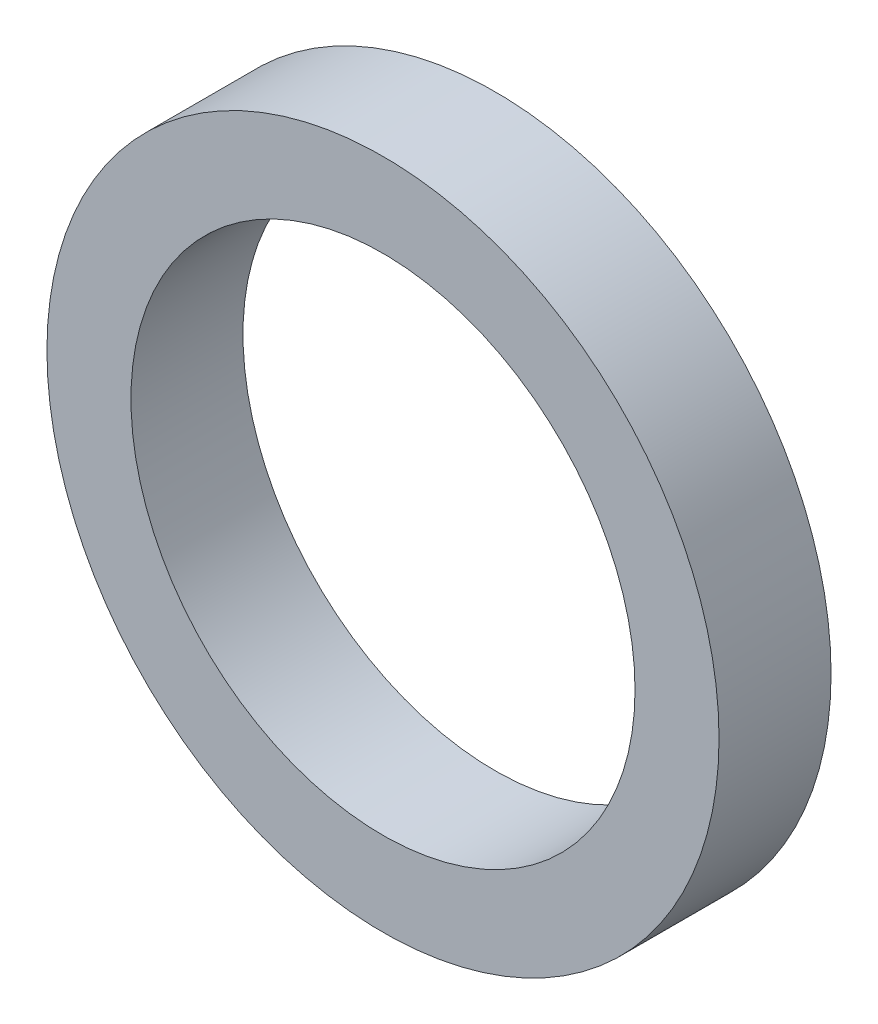
ISO-10303-21;
HEADER;
FILE_DESCRIPTION(('STEP AP214'),'2;1');
FILE_NAME('part.step','',(''),(''),'','','');
FILE_SCHEMA(('AUTOMOTIVE_DESIGN { 1 0 10303 214 1 1 1 1 }'));
ENDSEC;
DATA;
#1=APPLICATION_CONTEXT('core data for automotive mechanical design processes');
#2=APPLICATION_PROTOCOL_DEFINITION('international standard','automotive_design',2000,#1);
#3=PRODUCT_CONTEXT('',#1,'mechanical');
#4=PRODUCT('Part','Part','',(#3));
#5=PRODUCT_RELATED_PRODUCT_CATEGORY('part','',(#4));
#6=PRODUCT_DEFINITION_FORMATION('','',#4);
#7=PRODUCT_DEFINITION_CONTEXT('part definition',#1,'design');
#8=PRODUCT_DEFINITION('design','',#6,#7);
#9=PRODUCT_DEFINITION_SHAPE('','',#8);
#10=(LENGTH_UNIT() NAMED_UNIT(*) SI_UNIT(.MILLI.,.METRE.));
#11=(NAMED_UNIT(*) PLANE_ANGLE_UNIT() SI_UNIT($,.RADIAN.));
#12=(NAMED_UNIT(*) SI_UNIT($,.STERADIAN.) SOLID_ANGLE_UNIT());
#13=UNCERTAINTY_MEASURE_WITH_UNIT(LENGTH_MEASURE(1.E-05),#10,'distance_accuracy_value','');
#14=(GEOMETRIC_REPRESENTATION_CONTEXT(3) GLOBAL_UNCERTAINTY_ASSIGNED_CONTEXT((#13)) GLOBAL_UNIT_ASSIGNED_CONTEXT((#10,
#11,#12)) REPRESENTATION_CONTEXT('',''));
#15=CARTESIAN_POINT('',(0.,0.,0.));
#16=DIRECTION('',(0.,0.,1.));
#17=DIRECTION('',(1.,0.,0.));
#18=AXIS2_PLACEMENT_3D('',#15,#16,#17);
#19=CARTESIAN_POINT('',(0.,0.,-10.));
#20=DIRECTION('',(0.,0.,-1.));
#21=DIRECTION('',(1.,0.,0.));
#22=AXIS2_PLACEMENT_3D('',#19,#20,#21);
#23=PLANE('',#22);
#24=CARTESIAN_POINT('',(0.,0.,-10.));
#25=DIRECTION('',(0.,0.,1.));
#26=DIRECTION('',(1.,0.,0.));
#27=AXIS2_PLACEMENT_3D('',#24,#25,#26);
#28=CIRCLE('',#27,30.);
#29=CARTESIAN_POINT('',(30.,0.,-10.));
#30=VERTEX_POINT('',#29);
#31=EDGE_CURVE('E10',#30,#30,#28,.T.);
#32=ORIENTED_EDGE('',*,*,#31,.F.);
#33=EDGE_LOOP('',(#32));
#34=FACE_BOUND('',#33,.T.);
#35=CARTESIAN_POINT('',(0.,0.,-10.));
#36=DIRECTION('',(0.,0.,1.));
#37=DIRECTION('',(1.,0.,0.));
#38=AXIS2_PLACEMENT_3D('',#35,#36,#37);
#39=CIRCLE('',#38,22.5);
#40=CARTESIAN_POINT('',(22.5,0.,-10.));
#41=VERTEX_POINT('',#40);
#42=EDGE_CURVE('E52',#41,#41,#39,.T.);
#43=ORIENTED_EDGE('',*,*,#42,.T.);
#44=EDGE_LOOP('',(#43));
#45=FACE_BOUND('',#44,.T.);
#46=ADVANCED_FACE('F41',(#34,#45),#23,.T.);
#47=CARTESIAN_POINT('',(0.,0.,0.));
#48=DIRECTION('',(0.,0.,-1.));
#49=DIRECTION('',(1.,0.,0.));
#50=AXIS2_PLACEMENT_3D('',#47,#48,#49);
#51=PLANE('',#50);
#52=CARTESIAN_POINT('',(0.,0.,0.));
#53=DIRECTION('',(0.,0.,1.));
#54=DIRECTION('',(1.,0.,0.));
#55=AXIS2_PLACEMENT_3D('',#52,#53,#54);
#56=CIRCLE('',#55,30.);
#57=CARTESIAN_POINT('',(30.,0.,0.));
#58=VERTEX_POINT('',#57);
#59=EDGE_CURVE('E45',#58,#58,#56,.T.);
#60=ORIENTED_EDGE('',*,*,#59,.T.);
#61=EDGE_LOOP('',(#60));
#62=FACE_BOUND('',#61,.T.);
#63=CARTESIAN_POINT('',(0.,0.,0.));
#64=DIRECTION('',(0.,0.,1.));
#65=DIRECTION('',(1.,0.,0.));
#66=AXIS2_PLACEMENT_3D('',#63,#64,#65);
#67=CIRCLE('',#66,22.5);
#68=CARTESIAN_POINT('',(22.5,0.,0.));
#69=VERTEX_POINT('',#68);
#70=EDGE_CURVE('E54',#69,#69,#67,.T.);
#71=ORIENTED_EDGE('',*,*,#70,.F.);
#72=EDGE_LOOP('',(#71));
#73=FACE_BOUND('',#72,.T.);
#74=ADVANCED_FACE('F67',(#62,#73),#51,.F.);
#75=CARTESIAN_POINT('',(0.,0.,-10.));
#76=DIRECTION('',(0.,0.,1.));
#77=DIRECTION('',(-1.,0.,0.));
#78=AXIS2_PLACEMENT_3D('',#75,#76,#77);
#79=CYLINDRICAL_SURFACE('',#78,30.);
#80=ORIENTED_EDGE('',*,*,#31,.T.);
#81=EDGE_LOOP('',(#80));
#82=FACE_BOUND('',#81,.T.);
#83=ORIENTED_EDGE('',*,*,#59,.F.);
#84=EDGE_LOOP('',(#83));
#85=FACE_BOUND('',#84,.T.);
#86=ADVANCED_FACE('F43',(#82,#85),#79,.T.);
#87=CARTESIAN_POINT('',(0.,0.,-10.));
#88=DIRECTION('',(0.,0.,1.));
#89=DIRECTION('',(-1.,0.,0.));
#90=AXIS2_PLACEMENT_3D('',#87,#88,#89);
#91=CYLINDRICAL_SURFACE('',#90,22.5);
#92=ORIENTED_EDGE('',*,*,#42,.F.);
#93=EDGE_LOOP('',(#92));
#94=FACE_BOUND('',#93,.T.);
#95=ORIENTED_EDGE('',*,*,#70,.T.);
#96=EDGE_LOOP('',(#95));
#97=FACE_BOUND('',#96,.T.);
#98=ADVANCED_FACE('F61',(#94,#97),#91,.F.);
#99=CLOSED_SHELL('',(#46,#74,#86,#98));
#100=MANIFOLD_SOLID_BREP('B2',#99);
#101=ADVANCED_BREP_SHAPE_REPRESENTATION('',(#18,#100),#14);
#102=SHAPE_DEFINITION_REPRESENTATION(#9,#101);
ENDSEC;
END-ISO-10303-21;
